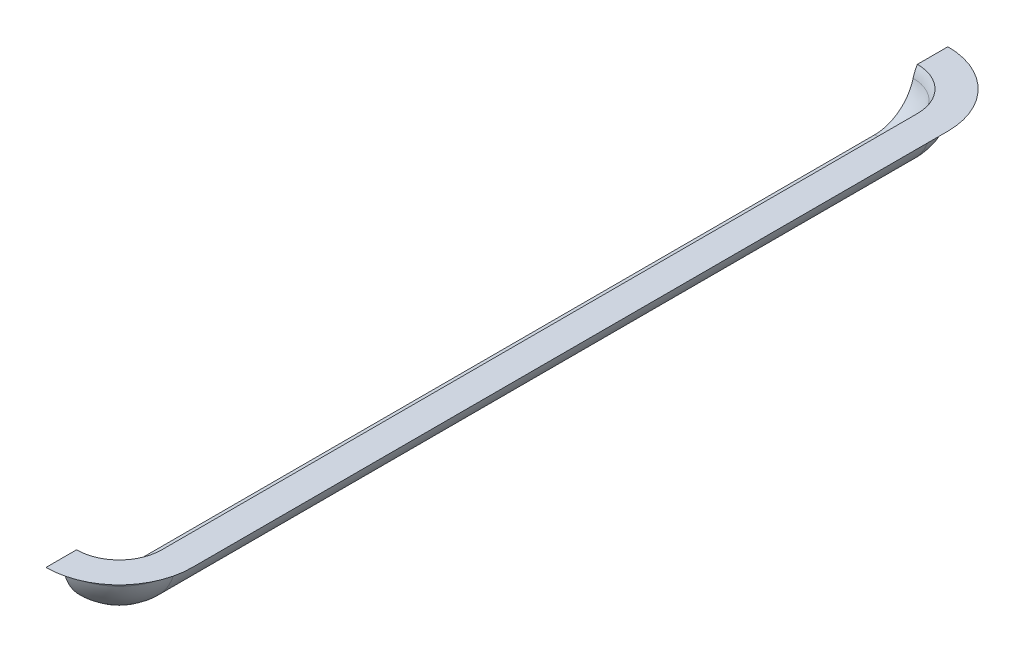
ISO-10303-21;
HEADER;
FILE_DESCRIPTION(('STEP AP214'),'2;1');
FILE_NAME('part.step','',(''),(''),'','','');
FILE_SCHEMA(('AUTOMOTIVE_DESIGN { 1 0 10303 214 1 1 1 1 }'));
ENDSEC;
DATA;
#1=APPLICATION_CONTEXT('core data for automotive mechanical design processes');
#2=APPLICATION_PROTOCOL_DEFINITION('international standard','automotive_design',2000,#1);
#3=PRODUCT_CONTEXT('',#1,'mechanical');
#4=PRODUCT('Part','Part','',(#3));
#5=PRODUCT_RELATED_PRODUCT_CATEGORY('part','',(#4));
#6=PRODUCT_DEFINITION_FORMATION('','',#4);
#7=PRODUCT_DEFINITION_CONTEXT('part definition',#1,'design');
#8=PRODUCT_DEFINITION('design','',#6,#7);
#9=PRODUCT_DEFINITION_SHAPE('','',#8);
#10=(LENGTH_UNIT() NAMED_UNIT(*) SI_UNIT(.MILLI.,.METRE.));
#11=(NAMED_UNIT(*) PLANE_ANGLE_UNIT() SI_UNIT($,.RADIAN.));
#12=(NAMED_UNIT(*) SI_UNIT($,.STERADIAN.) SOLID_ANGLE_UNIT());
#13=UNCERTAINTY_MEASURE_WITH_UNIT(LENGTH_MEASURE(1.E-05),#10,'distance_accuracy_value','');
#14=(GEOMETRIC_REPRESENTATION_CONTEXT(3) GLOBAL_UNCERTAINTY_ASSIGNED_CONTEXT((#13)) GLOBAL_UNIT_ASSIGNED_CONTEXT((#10,
#11,#12)) REPRESENTATION_CONTEXT('',''));
#15=CARTESIAN_POINT('',(0.,0.,0.));
#16=DIRECTION('',(0.,0.,1.));
#17=DIRECTION('',(1.,0.,0.));
#18=AXIS2_PLACEMENT_3D('',#15,#16,#17);
#19=CARTESIAN_POINT('',(-3.,0.,40.));
#20=DIRECTION('',(1.,0.,0.));
#21=DIRECTION('',(0.,0.,-1.));
#22=AXIS2_PLACEMENT_3D('',#19,#20,#21);
#23=PLANE('',#22);
#24=CARTESIAN_POINT('',(-3.,-2.,-47.7459666924148));
#25=DIRECTION('',(1.,0.,0.));
#26=DIRECTION('',(0.,0.,-1.));
#27=AXIS2_PLACEMENT_3D('',#24,#25,#26);
#28=CIRCLE('',#27,3.8);
#29=CARTESIAN_POINT('',(-3.,0.,-44.5148678081341));
#30=VERTEX_POINT('',#29);
#31=CARTESIAN_POINT('',(-3.00000000000001,-1.05,-44.0666325135178));
#32=VERTEX_POINT('',#31);
#33=EDGE_CURVE('E170',#30,#32,#28,.T.);
#34=ORIENTED_EDGE('',*,*,#33,.F.);
#35=DIRECTION('',(0.,0.,-1.));
#36=VECTOR('',#35,1.);
#37=CARTESIAN_POINT('',(-3.,0.,40.));
#38=LINE('',#37,#36);
#39=CARTESIAN_POINT('',(-3.,0.,-47.7459666924148));
#40=VERTEX_POINT('',#39);
#41=EDGE_CURVE('E124',#30,#40,#38,.T.);
#42=ORIENTED_EDGE('',*,*,#41,.T.);
#43=CARTESIAN_POINT('',(-3.,-2.,-47.7459666924148));
#44=DIRECTION('',(1.,0.,0.));
#45=DIRECTION('',(0.,0.,-1.));
#46=AXIS2_PLACEMENT_3D('',#43,#44,#45);
#47=CIRCLE('',#46,2.);
#48=CARTESIAN_POINT('',(-3.00000000000002,-1.5,-45.8094750193111));
#49=VERTEX_POINT('',#48);
#50=EDGE_CURVE('E158',#40,#49,#47,.T.);
#51=ORIENTED_EDGE('',*,*,#50,.T.);
#52=CARTESIAN_POINT('',(-3.,0.,-40.));
#53=DIRECTION('',(-1.,0.,0.));
#54=DIRECTION('',(0.,0.,1.));
#55=AXIS2_PLACEMENT_3D('',#52,#53,#54);
#56=CIRCLE('',#55,6.);
#57=CARTESIAN_POINT('',(-3.,-6.,-40.));
#58=VERTEX_POINT('',#57);
#59=EDGE_CURVE('E156',#49,#58,#56,.T.);
#60=ORIENTED_EDGE('',*,*,#59,.T.);
#61=DIRECTION('',(0.,0.,-1.));
#62=VECTOR('',#61,1.);
#63=CARTESIAN_POINT('',(-3.,-6.,40.));
#64=LINE('',#63,#62);
#65=CARTESIAN_POINT('',(-3.,-6.,40.));
#66=VERTEX_POINT('',#65);
#67=EDGE_CURVE('E145',#66,#58,#64,.T.);
#68=ORIENTED_EDGE('',*,*,#67,.F.);
#69=CARTESIAN_POINT('',(-3.,0.,40.));
#70=DIRECTION('',(-1.,0.,0.));
#71=DIRECTION('',(0.,0.,1.));
#72=AXIS2_PLACEMENT_3D('',#69,#70,#71);
#73=CIRCLE('',#72,6.);
#74=CARTESIAN_POINT('',(-3.00000000000002,-1.5,45.8094750193111));
#75=VERTEX_POINT('',#74);
#76=EDGE_CURVE('E130',#66,#75,#73,.T.);
#77=ORIENTED_EDGE('',*,*,#76,.T.);
#78=CARTESIAN_POINT('',(-3.,-2.,47.7459666924148));
#79=DIRECTION('',(1.,0.,0.));
#80=DIRECTION('',(0.,0.,-1.));
#81=AXIS2_PLACEMENT_3D('',#78,#79,#80);
#82=CIRCLE('',#81,2.);
#83=CARTESIAN_POINT('',(-3.,0.,47.7459666924148));
#84=VERTEX_POINT('',#83);
#85=EDGE_CURVE('E122',#75,#84,#82,.T.);
#86=ORIENTED_EDGE('',*,*,#85,.T.);
#87=CARTESIAN_POINT('',(-3.,0.,44.5148678081341));
#88=VERTEX_POINT('',#87);
#89=EDGE_CURVE('E115',#84,#88,#38,.T.);
#90=ORIENTED_EDGE('',*,*,#89,.T.);
#91=CARTESIAN_POINT('',(-3.,-2.,47.7459666924148));
#92=DIRECTION('',(1.,0.,0.));
#93=DIRECTION('',(0.,0.,-1.));
#94=AXIS2_PLACEMENT_3D('',#91,#92,#93);
#95=CIRCLE('',#94,3.8);
#96=CARTESIAN_POINT('',(-3.00000000000001,-1.05,44.0666325135178));
#97=VERTEX_POINT('',#96);
#98=EDGE_CURVE('E159',#97,#88,#95,.T.);
#99=ORIENTED_EDGE('',*,*,#98,.F.);
#100=CARTESIAN_POINT('',(-3.,0.,40.));
#101=DIRECTION('',(1.,0.,0.));
#102=DIRECTION('',(0.,0.,-1.));
#103=AXIS2_PLACEMENT_3D('',#100,#101,#102);
#104=CIRCLE('',#103,4.2);
#105=CARTESIAN_POINT('',(-2.99999999999999,-4.2,40.));
#106=VERTEX_POINT('',#105);
#107=EDGE_CURVE('E162',#106,#97,#104,.F.);
#108=ORIENTED_EDGE('',*,*,#107,.F.);
#109=DIRECTION('',(0.,0.,-1.));
#110=VECTOR('',#109,1.);
#111=CARTESIAN_POINT('',(-2.99999999999999,-4.2,40.));
#112=LINE('',#111,#110);
#113=CARTESIAN_POINT('',(-2.99999999999999,-4.2,-40.));
#114=VERTEX_POINT('',#113);
#115=EDGE_CURVE('E121',#106,#114,#112,.T.);
#116=ORIENTED_EDGE('',*,*,#115,.T.);
#117=CARTESIAN_POINT('',(-3.,0.,-40.));
#118=DIRECTION('',(1.,0.,0.));
#119=DIRECTION('',(0.,0.,-1.));
#120=AXIS2_PLACEMENT_3D('',#117,#118,#119);
#121=CIRCLE('',#120,4.2);
#122=EDGE_CURVE('E164',#32,#114,#121,.F.);
#123=ORIENTED_EDGE('',*,*,#122,.F.);
#124=EDGE_LOOP('',(#34,#42,#51,#60,#68,#77,#86,#90,#99,#108,#116,#123));
#125=FACE_BOUND('',#124,.T.);
#126=ADVANCED_FACE('F37',(#125),#23,.F.);
#127=CARTESIAN_POINT('',(-3.,0.,40.));
#128=DIRECTION('',(0.,0.,-1.));
#129=DIRECTION('',(-1.,0.,0.));
#130=AXIS2_PLACEMENT_3D('',#127,#128,#129);
#131=CYLINDRICAL_SURFACE('',#130,6.);
#132=CARTESIAN_POINT('',(-3.,0.,-40.));
#133=DIRECTION('',(0.,0.,1.));
#134=DIRECTION('',(1.,0.,0.));
#135=AXIS2_PLACEMENT_3D('',#132,#133,#134);
#136=CIRCLE('',#135,6.);
#137=CARTESIAN_POINT('',(2.80947501931112,-1.5,-40.));
#138=VERTEX_POINT('',#137);
#139=EDGE_CURVE('E150',#58,#138,#136,.T.);
#140=ORIENTED_EDGE('',*,*,#139,.T.);
#141=DIRECTION('',(0.,0.,-1.));
#142=VECTOR('',#141,1.);
#143=CARTESIAN_POINT('',(2.80947501931112,-1.5,40.));
#144=LINE('',#143,#142);
#145=CARTESIAN_POINT('',(2.80947501931112,-1.5,40.));
#146=VERTEX_POINT('',#145);
#147=EDGE_CURVE('E148',#138,#146,#144,.F.);
#148=ORIENTED_EDGE('',*,*,#147,.T.);
#149=CARTESIAN_POINT('',(-3.,0.,40.));
#150=DIRECTION('',(0.,0.,1.));
#151=DIRECTION('',(1.,0.,0.));
#152=AXIS2_PLACEMENT_3D('',#149,#150,#151);
#153=CIRCLE('',#152,6.);
#154=EDGE_CURVE('E147',#66,#146,#153,.T.);
#155=ORIENTED_EDGE('',*,*,#154,.F.);
#156=ORIENTED_EDGE('',*,*,#67,.T.);
#157=EDGE_LOOP('',(#140,#148,#155,#156));
#158=FACE_BOUND('',#157,.T.);
#159=ADVANCED_FACE('F217',(#158),#131,.T.);
#160=CARTESIAN_POINT('',(-3.,0.,40.));
#161=DIRECTION('',(0.,1.,0.));
#162=DIRECTION('',(0.,0.,1.));
#163=AXIS2_PLACEMENT_3D('',#160,#161,#162);
#164=SPHERICAL_SURFACE('',#163,6.);
#165=ORIENTED_EDGE('',*,*,#154,.T.);
#166=CARTESIAN_POINT('',(-3.,-1.5,40.));
#167=DIRECTION('',(0.,1.,0.));
#168=DIRECTION('',(0.,0.,1.));
#169=AXIS2_PLACEMENT_3D('',#166,#167,#168);
#170=CIRCLE('',#169,5.80947501931112);
#171=EDGE_CURVE('E142',#146,#75,#170,.F.);
#172=ORIENTED_EDGE('',*,*,#171,.T.);
#173=ORIENTED_EDGE('',*,*,#76,.F.);
#174=EDGE_LOOP('',(#165,#172,#173));
#175=FACE_BOUND('',#174,.T.);
#176=ADVANCED_FACE('F222',(#175),#164,.T.);
#177=CARTESIAN_POINT('',(-3.,0.,-40.));
#178=DIRECTION('',(0.,-1.,0.));
#179=DIRECTION('',(0.,0.,-1.));
#180=AXIS2_PLACEMENT_3D('',#177,#178,#179);
#181=SPHERICAL_SURFACE('',#180,6.);
#182=ORIENTED_EDGE('',*,*,#59,.F.);
#183=CARTESIAN_POINT('',(-3.,-1.5,-40.));
#184=DIRECTION('',(0.,1.,0.));
#185=DIRECTION('',(0.,0.,1.));
#186=AXIS2_PLACEMENT_3D('',#183,#184,#185);
#187=CIRCLE('',#186,5.80947501931112);
#188=EDGE_CURVE('E348',#49,#138,#187,.F.);
#189=ORIENTED_EDGE('',*,*,#188,.T.);
#190=ORIENTED_EDGE('',*,*,#139,.F.);
#191=EDGE_LOOP('',(#182,#189,#190));
#192=FACE_BOUND('',#191,.T.);
#193=ADVANCED_FACE('F229',(#192),#181,.T.);
#194=CARTESIAN_POINT('',(-3.,-2.,-40.));
#195=DIRECTION('',(0.,1.,0.));
#196=DIRECTION('',(0.,0.,1.));
#197=AXIS2_PLACEMENT_3D('',#194,#195,#196);
#198=TOROIDAL_SURFACE('',#197,7.74596669241483,2.);
#199=ORIENTED_EDGE('',*,*,#50,.F.);
#200=CARTESIAN_POINT('',(-3.,0.,-40.));
#201=DIRECTION('',(0.,1.,0.));
#202=DIRECTION('',(0.,0.,1.));
#203=AXIS2_PLACEMENT_3D('',#200,#201,#202);
#204=CIRCLE('',#203,7.74596669241483);
#205=CARTESIAN_POINT('',(4.74596669241483,0.,-40.));
#206=VERTEX_POINT('',#205);
#207=EDGE_CURVE('E11',#206,#40,#204,.T.);
#208=ORIENTED_EDGE('',*,*,#207,.F.);
#209=CARTESIAN_POINT('',(4.74596669241484,-2.,-40.));
#210=DIRECTION('',(0.,0.,-1.));
#211=DIRECTION('',(-1.,0.,0.));
#212=AXIS2_PLACEMENT_3D('',#209,#210,#211);
#213=CIRCLE('',#212,2.);
#214=EDGE_CURVE('E354',#138,#206,#213,.T.);
#215=ORIENTED_EDGE('',*,*,#214,.F.);
#216=ORIENTED_EDGE('',*,*,#188,.F.);
#217=EDGE_LOOP('',(#199,#208,#215,#216));
#218=FACE_BOUND('',#217,.T.);
#219=ADVANCED_FACE('F233',(#218),#198,.F.);
#220=CARTESIAN_POINT('',(4.74596669241483,-2.,40.));
#221=DIRECTION('',(0.,0.,-1.));
#222=DIRECTION('',(-1.,0.,0.));
#223=AXIS2_PLACEMENT_3D('',#220,#221,#222);
#224=CYLINDRICAL_SURFACE('',#223,2.);
#225=ORIENTED_EDGE('',*,*,#214,.T.);
#226=DIRECTION('',(0.,0.,1.));
#227=VECTOR('',#226,1.);
#228=CARTESIAN_POINT('',(4.74596669241483,0.,-40.));
#229=LINE('',#228,#227);
#230=CARTESIAN_POINT('',(4.74596669241483,0.,40.));
#231=VERTEX_POINT('',#230);
#232=EDGE_CURVE('E47',#231,#206,#229,.F.);
#233=ORIENTED_EDGE('',*,*,#232,.F.);
#234=CARTESIAN_POINT('',(4.74596669241483,-2.,40.));
#235=DIRECTION('',(0.,0.,-1.));
#236=DIRECTION('',(-1.,0.,0.));
#237=AXIS2_PLACEMENT_3D('',#234,#235,#236);
#238=CIRCLE('',#237,2.);
#239=EDGE_CURVE('E136',#146,#231,#238,.T.);
#240=ORIENTED_EDGE('',*,*,#239,.F.);
#241=ORIENTED_EDGE('',*,*,#147,.F.);
#242=EDGE_LOOP('',(#225,#233,#240,#241));
#243=FACE_BOUND('',#242,.T.);
#244=ADVANCED_FACE('F289',(#243),#224,.F.);
#245=CARTESIAN_POINT('',(-3.,-2.,40.));
#246=DIRECTION('',(0.,1.,0.));
#247=DIRECTION('',(0.,0.,1.));
#248=AXIS2_PLACEMENT_3D('',#245,#246,#247);
#249=TOROIDAL_SURFACE('',#248,7.74596669241483,2.);
#250=ORIENTED_EDGE('',*,*,#85,.F.);
#251=ORIENTED_EDGE('',*,*,#171,.F.);
#252=ORIENTED_EDGE('',*,*,#239,.T.);
#253=CARTESIAN_POINT('',(-3.,0.,40.));
#254=DIRECTION('',(0.,1.,0.));
#255=DIRECTION('',(0.,0.,1.));
#256=AXIS2_PLACEMENT_3D('',#253,#254,#255);
#257=CIRCLE('',#256,7.74596669241483);
#258=EDGE_CURVE('E112',#84,#231,#257,.T.);
#259=ORIENTED_EDGE('',*,*,#258,.F.);
#260=EDGE_LOOP('',(#250,#251,#252,#259));
#261=FACE_BOUND('',#260,.T.);
#262=ADVANCED_FACE('F134',(#261),#249,.F.);
#263=CARTESIAN_POINT('',(-3.,0.,40.));
#264=DIRECTION('',(0.,0.,-1.));
#265=DIRECTION('',(-1.,0.,0.));
#266=AXIS2_PLACEMENT_3D('',#263,#264,#265);
#267=CYLINDRICAL_SURFACE('',#266,4.2);
#268=CARTESIAN_POINT('',(-3.,0.,-40.));
#269=DIRECTION('',(0.,0.,-1.));
#270=DIRECTION('',(-1.,0.,0.));
#271=AXIS2_PLACEMENT_3D('',#268,#269,#270);
#272=CIRCLE('',#271,4.2);
#273=CARTESIAN_POINT('',(1.06663251351779,-1.05,-40.));
#274=VERTEX_POINT('',#273);
#275=EDGE_CURVE('E169',#114,#274,#272,.F.);
#276=ORIENTED_EDGE('',*,*,#275,.F.);
#277=ORIENTED_EDGE('',*,*,#115,.F.);
#278=CARTESIAN_POINT('',(-3.,0.,40.));
#279=DIRECTION('',(0.,0.,1.));
#280=DIRECTION('',(1.,0.,0.));
#281=AXIS2_PLACEMENT_3D('',#278,#279,#280);
#282=CIRCLE('',#281,4.2);
#283=CARTESIAN_POINT('',(1.06663251351779,-1.05,40.));
#284=VERTEX_POINT('',#283);
#285=EDGE_CURVE('E165',#106,#284,#282,.T.);
#286=ORIENTED_EDGE('',*,*,#285,.T.);
#287=DIRECTION('',(0.,0.,-1.));
#288=VECTOR('',#287,1.);
#289=CARTESIAN_POINT('',(1.06663251351779,-1.05,40.));
#290=LINE('',#289,#288);
#291=EDGE_CURVE('E176',#274,#284,#290,.F.);
#292=ORIENTED_EDGE('',*,*,#291,.F.);
#293=EDGE_LOOP('',(#276,#277,#286,#292));
#294=FACE_BOUND('',#293,.T.);
#295=ADVANCED_FACE('F196',(#294),#267,.F.);
#296=CARTESIAN_POINT('',(-3.,0.,40.));
#297=DIRECTION('',(0.,1.,0.));
#298=DIRECTION('',(0.,0.,1.));
#299=AXIS2_PLACEMENT_3D('',#296,#297,#298);
#300=SPHERICAL_SURFACE('',#299,4.2);
#301=ORIENTED_EDGE('',*,*,#285,.F.);
#302=ORIENTED_EDGE('',*,*,#107,.T.);
#303=CARTESIAN_POINT('',(-3.,-1.05,40.));
#304=DIRECTION('',(0.,1.,0.));
#305=DIRECTION('',(0.,0.,1.));
#306=AXIS2_PLACEMENT_3D('',#303,#304,#305);
#307=CIRCLE('',#306,4.06663251351779);
#308=EDGE_CURVE('E161',#284,#97,#307,.F.);
#309=ORIENTED_EDGE('',*,*,#308,.F.);
#310=EDGE_LOOP('',(#301,#302,#309));
#311=FACE_BOUND('',#310,.T.);
#312=ADVANCED_FACE('F202',(#311),#300,.F.);
#313=CARTESIAN_POINT('',(-3.,0.,-40.));
#314=DIRECTION('',(0.,-1.,0.));
#315=DIRECTION('',(0.,0.,-1.));
#316=AXIS2_PLACEMENT_3D('',#313,#314,#315);
#317=SPHERICAL_SURFACE('',#316,4.2);
#318=ORIENTED_EDGE('',*,*,#122,.T.);
#319=ORIENTED_EDGE('',*,*,#275,.T.);
#320=CARTESIAN_POINT('',(-3.,-1.05,-40.));
#321=DIRECTION('',(0.,-1.,0.));
#322=DIRECTION('',(1.,0.,0.));
#323=AXIS2_PLACEMENT_3D('',#320,#321,#322);
#324=CIRCLE('',#323,4.06663251351779);
#325=EDGE_CURVE('E172',#32,#274,#324,.T.);
#326=ORIENTED_EDGE('',*,*,#325,.F.);
#327=EDGE_LOOP('',(#318,#319,#326));
#328=FACE_BOUND('',#327,.T.);
#329=ADVANCED_FACE('F207',(#328),#317,.F.);
#330=CARTESIAN_POINT('',(-3.,-2.,-40.));
#331=DIRECTION('',(0.,1.,0.));
#332=DIRECTION('',(0.,0.,1.));
#333=AXIS2_PLACEMENT_3D('',#330,#331,#332);
#334=TOROIDAL_SURFACE('',#333,7.74596669241483,3.8);
#335=CARTESIAN_POINT('',(-3.,0.,-40.));
#336=DIRECTION('',(0.,1.,0.));
#337=DIRECTION('',(0.,0.,1.));
#338=AXIS2_PLACEMENT_3D('',#335,#336,#337);
#339=CIRCLE('',#338,4.51486780813413);
#340=CARTESIAN_POINT('',(1.51486780813413,0.,-40.));
#341=VERTEX_POINT('',#340);
#342=EDGE_CURVE('E69',#30,#341,#339,.F.);
#343=ORIENTED_EDGE('',*,*,#342,.F.);
#344=ORIENTED_EDGE('',*,*,#33,.T.);
#345=ORIENTED_EDGE('',*,*,#325,.T.);
#346=CARTESIAN_POINT('',(4.74596669241483,-2.,-40.));
#347=DIRECTION('',(0.,0.,-1.));
#348=DIRECTION('',(-1.,0.,0.));
#349=AXIS2_PLACEMENT_3D('',#346,#347,#348);
#350=CIRCLE('',#349,3.8);
#351=EDGE_CURVE('E182',#274,#341,#350,.T.);
#352=ORIENTED_EDGE('',*,*,#351,.T.);
#353=EDGE_LOOP('',(#343,#344,#345,#352));
#354=FACE_BOUND('',#353,.T.);
#355=ADVANCED_FACE('F189',(#354),#334,.T.);
#356=CARTESIAN_POINT('',(4.74596669241483,-2.,40.));
#357=DIRECTION('',(0.,0.,-1.));
#358=DIRECTION('',(-1.,0.,0.));
#359=AXIS2_PLACEMENT_3D('',#356,#357,#358);
#360=CYLINDRICAL_SURFACE('',#359,3.8);
#361=DIRECTION('',(0.,0.,-1.));
#362=VECTOR('',#361,1.);
#363=CARTESIAN_POINT('',(1.51486780813413,0.,40.));
#364=LINE('',#363,#362);
#365=CARTESIAN_POINT('',(1.51486780813413,0.,40.));
#366=VERTEX_POINT('',#365);
#367=EDGE_CURVE('E41',#341,#366,#364,.F.);
#368=ORIENTED_EDGE('',*,*,#367,.F.);
#369=ORIENTED_EDGE('',*,*,#351,.F.);
#370=ORIENTED_EDGE('',*,*,#291,.T.);
#371=CARTESIAN_POINT('',(4.74596669241484,-2.,40.));
#372=DIRECTION('',(0.,0.,1.));
#373=DIRECTION('',(1.,0.,0.));
#374=AXIS2_PLACEMENT_3D('',#371,#372,#373);
#375=CIRCLE('',#374,3.8);
#376=EDGE_CURVE('E173',#284,#366,#375,.F.);
#377=ORIENTED_EDGE('',*,*,#376,.T.);
#378=EDGE_LOOP('',(#368,#369,#370,#377));
#379=FACE_BOUND('',#378,.T.);
#380=ADVANCED_FACE('F193',(#379),#360,.T.);
#381=CARTESIAN_POINT('',(-3.,-2.,40.));
#382=DIRECTION('',(0.,1.,0.));
#383=DIRECTION('',(0.,0.,1.));
#384=AXIS2_PLACEMENT_3D('',#381,#382,#383);
#385=TOROIDAL_SURFACE('',#384,7.74596669241483,3.8);
#386=CARTESIAN_POINT('',(-3.,0.,40.));
#387=DIRECTION('',(0.,1.,0.));
#388=DIRECTION('',(0.,0.,1.));
#389=AXIS2_PLACEMENT_3D('',#386,#387,#388);
#390=CIRCLE('',#389,4.51486780813413);
#391=EDGE_CURVE('E117',#366,#88,#390,.F.);
#392=ORIENTED_EDGE('',*,*,#391,.F.);
#393=ORIENTED_EDGE('',*,*,#376,.F.);
#394=ORIENTED_EDGE('',*,*,#308,.T.);
#395=ORIENTED_EDGE('',*,*,#98,.T.);
#396=EDGE_LOOP('',(#392,#393,#394,#395));
#397=FACE_BOUND('',#396,.T.);
#398=ADVANCED_FACE('F204',(#397),#385,.T.);
#399=CARTESIAN_POINT('',(15.,0.,-60.));
#400=DIRECTION('',(0.,-1.,0.));
#401=DIRECTION('',(0.,0.,-1.));
#402=AXIS2_PLACEMENT_3D('',#399,#400,#401);
#403=PLANE('',#402);
#404=ORIENTED_EDGE('',*,*,#41,.F.);
#405=ORIENTED_EDGE('',*,*,#342,.T.);
#406=ORIENTED_EDGE('',*,*,#367,.T.);
#407=ORIENTED_EDGE('',*,*,#391,.T.);
#408=ORIENTED_EDGE('',*,*,#89,.F.);
#409=ORIENTED_EDGE('',*,*,#258,.T.);
#410=ORIENTED_EDGE('',*,*,#232,.T.);
#411=ORIENTED_EDGE('',*,*,#207,.T.);
#412=EDGE_LOOP('',(#404,#405,#406,#407,#408,#409,#410,#411));
#413=FACE_BOUND('',#412,.T.);
#414=ADVANCED_FACE('F39',(#413),#403,.F.);
#415=CLOSED_SHELL('',(#126,#159,#176,#193,#219,#244,#262,#295,#312,#329,#355,#380,#398,#414));
#416=MANIFOLD_SOLID_BREP('B2',#415);
#417=ADVANCED_BREP_SHAPE_REPRESENTATION('',(#18,#416),#14);
#418=SHAPE_DEFINITION_REPRESENTATION(#9,#417);
ENDSEC;
END-ISO-10303-21;
